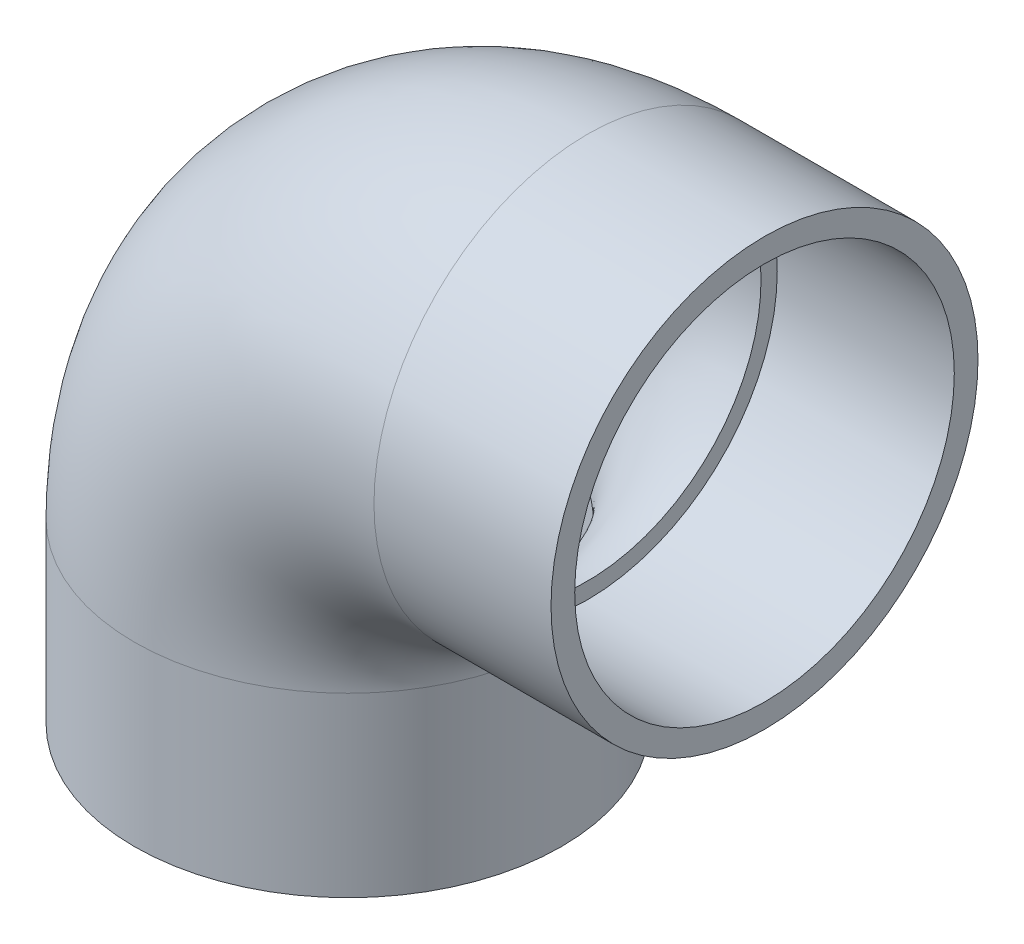
ISO-10303-21;
HEADER;
FILE_DESCRIPTION(('STEP AP214'),'2;1');
FILE_NAME('part.step','',(''),(''),'','','');
FILE_SCHEMA(('AUTOMOTIVE_DESIGN { 1 0 10303 214 1 1 1 1 }'));
ENDSEC;
DATA;
#1=APPLICATION_CONTEXT('core data for automotive mechanical design processes');
#2=APPLICATION_PROTOCOL_DEFINITION('international standard','automotive_design',2000,#1);
#3=PRODUCT_CONTEXT('',#1,'mechanical');
#4=PRODUCT('Part','Part','',(#3));
#5=PRODUCT_RELATED_PRODUCT_CATEGORY('part','',(#4));
#6=PRODUCT_DEFINITION_FORMATION('','',#4);
#7=PRODUCT_DEFINITION_CONTEXT('part definition',#1,'design');
#8=PRODUCT_DEFINITION('design','',#6,#7);
#9=PRODUCT_DEFINITION_SHAPE('','',#8);
#10=(LENGTH_UNIT() NAMED_UNIT(*) SI_UNIT(.MILLI.,.METRE.));
#11=(NAMED_UNIT(*) PLANE_ANGLE_UNIT() SI_UNIT($,.RADIAN.));
#12=(NAMED_UNIT(*) SI_UNIT($,.STERADIAN.) SOLID_ANGLE_UNIT());
#13=UNCERTAINTY_MEASURE_WITH_UNIT(LENGTH_MEASURE(1.E-05),#10,'distance_accuracy_value','');
#14=(GEOMETRIC_REPRESENTATION_CONTEXT(3) GLOBAL_UNCERTAINTY_ASSIGNED_CONTEXT((#13)) GLOBAL_UNIT_ASSIGNED_CONTEXT((#10,
#11,#12)) REPRESENTATION_CONTEXT('',''));
#15=CARTESIAN_POINT('',(0.,0.,0.));
#16=DIRECTION('',(0.,0.,1.));
#17=DIRECTION('',(1.,0.,0.));
#18=AXIS2_PLACEMENT_3D('',#15,#16,#17);
#19=CARTESIAN_POINT('',(0.,0.,0.));
#20=DIRECTION('',(0.,1.,0.));
#21=DIRECTION('',(0.,0.,1.));
#22=AXIS2_PLACEMENT_3D('',#19,#20,#21);
#23=CYLINDRICAL_SURFACE('',#22,123.);
#24=CARTESIAN_POINT('',(0.,102.,0.));
#25=DIRECTION('',(0.,1.,0.));
#26=DIRECTION('',(0.,0.,1.));
#27=AXIS2_PLACEMENT_3D('',#24,#25,#26);
#28=CIRCLE('',#27,123.);
#29=CARTESIAN_POINT('',(-123.,102.,0.));
#30=VERTEX_POINT('',#29);
#31=EDGE_CURVE('E56',#30,#30,#28,.T.);
#32=ORIENTED_EDGE('',*,*,#31,.F.);
#33=EDGE_LOOP('',(#32));
#34=FACE_BOUND('',#33,.T.);
#35=CARTESIAN_POINT('',(0.,0.,0.));
#36=DIRECTION('',(0.,1.,0.));
#37=DIRECTION('',(0.,0.,1.));
#38=AXIS2_PLACEMENT_3D('',#35,#36,#37);
#39=CIRCLE('',#38,123.);
#40=CARTESIAN_POINT('',(0.,0.,123.));
#41=VERTEX_POINT('',#40);
#42=EDGE_CURVE('E54',#41,#41,#39,.T.);
#43=ORIENTED_EDGE('',*,*,#42,.T.);
#44=EDGE_LOOP('',(#43));
#45=FACE_BOUND('',#44,.T.);
#46=ADVANCED_FACE('F35',(#34,#45),#23,.T.);
#47=CARTESIAN_POINT('',(138.,102.,0.));
#48=DIRECTION('',(0.,0.,-1.));
#49=DIRECTION('',(-1.,0.,0.));
#50=AXIS2_PLACEMENT_3D('',#47,#48,#49);
#51=TOROIDAL_SURFACE('',#50,138.,123.);
#52=CARTESIAN_POINT('',(138.,240.,0.));
#53=DIRECTION('',(1.,0.,0.));
#54=DIRECTION('',(0.,0.,1.));
#55=AXIS2_PLACEMENT_3D('',#52,#53,#54);
#56=CIRCLE('',#55,123.);
#57=CARTESIAN_POINT('',(138.,363.,0.));
#58=VERTEX_POINT('',#57);
#59=EDGE_CURVE('E39',#58,#58,#56,.T.);
#60=CARTESIAN_POINT('',(138.,102.,0.));
#61=DIRECTION('',(0.,0.,-1.));
#62=DIRECTION('',(-1.,0.,0.));
#63=AXIS2_PLACEMENT_3D('',#60,#61,#62);
#64=CIRCLE('',#63,261.);
#65=EDGE_CURVE('',#30,#58,#64,.T.);
#66=ORIENTED_EDGE('',*,*,#31,.T.);
#67=ORIENTED_EDGE('',*,*,#59,.F.);
#68=ORIENTED_EDGE('',*,*,#65,.T.);
#69=ORIENTED_EDGE('',*,*,#65,.F.);
#70=EDGE_LOOP('',(#66,#68,#67,#69));
#71=FACE_BOUND('',#70,.T.);
#72=ADVANCED_FACE('F95',(#71),#51,.T.);
#73=CARTESIAN_POINT('',(138.,240.,0.));
#74=DIRECTION('',(1.,0.,0.));
#75=DIRECTION('',(0.,1.,0.));
#76=AXIS2_PLACEMENT_3D('',#73,#74,#75);
#77=CYLINDRICAL_SURFACE('',#76,123.);
#78=CARTESIAN_POINT('',(240.,240.,0.));
#79=DIRECTION('',(1.,0.,0.));
#80=DIRECTION('',(0.,0.,1.));
#81=AXIS2_PLACEMENT_3D('',#78,#79,#80);
#82=CIRCLE('',#81,123.);
#83=CARTESIAN_POINT('',(240.,240.,123.));
#84=VERTEX_POINT('',#83);
#85=EDGE_CURVE('E48',#84,#84,#82,.T.);
#86=ORIENTED_EDGE('',*,*,#85,.F.);
#87=EDGE_LOOP('',(#86));
#88=FACE_BOUND('',#87,.T.);
#89=ORIENTED_EDGE('',*,*,#59,.T.);
#90=EDGE_LOOP('',(#89));
#91=FACE_BOUND('',#90,.T.);
#92=ADVANCED_FACE('F37',(#88,#91),#77,.T.);
#93=CARTESIAN_POINT('',(0.,0.,0.));
#94=DIRECTION('',(0.,1.,0.));
#95=DIRECTION('',(0.,0.,1.));
#96=AXIS2_PLACEMENT_3D('',#93,#94,#95);
#97=PLANE('',#96);
#98=CARTESIAN_POINT('',(0.,0.,0.));
#99=DIRECTION('',(0.,-1.,0.));
#100=DIRECTION('',(0.,0.,-1.));
#101=AXIS2_PLACEMENT_3D('',#98,#99,#100);
#102=CIRCLE('',#101,109.35);
#103=CARTESIAN_POINT('',(0.,0.,-109.35));
#104=VERTEX_POINT('',#103);
#105=EDGE_CURVE('E63',#104,#104,#102,.T.);
#106=ORIENTED_EDGE('',*,*,#105,.F.);
#107=EDGE_LOOP('',(#106));
#108=FACE_BOUND('',#107,.T.);
#109=ORIENTED_EDGE('',*,*,#42,.F.);
#110=EDGE_LOOP('',(#109));
#111=FACE_BOUND('',#110,.T.);
#112=ADVANCED_FACE('F89',(#108,#111),#97,.F.);
#113=CARTESIAN_POINT('',(240.,240.,0.));
#114=DIRECTION('',(1.,0.,0.));
#115=DIRECTION('',(0.,0.,1.));
#116=AXIS2_PLACEMENT_3D('',#113,#114,#115);
#117=PLANE('',#116);
#118=CARTESIAN_POINT('',(240.,240.,0.));
#119=DIRECTION('',(1.,0.,0.));
#120=DIRECTION('',(0.,1.,0.));
#121=AXIS2_PLACEMENT_3D('',#118,#119,#120);
#122=CIRCLE('',#121,109.35);
#123=CARTESIAN_POINT('',(240.,349.35,0.));
#124=VERTEX_POINT('',#123);
#125=EDGE_CURVE('E70',#124,#124,#122,.T.);
#126=ORIENTED_EDGE('',*,*,#125,.F.);
#127=EDGE_LOOP('',(#126));
#128=FACE_BOUND('',#127,.T.);
#129=ORIENTED_EDGE('',*,*,#85,.T.);
#130=EDGE_LOOP('',(#129));
#131=FACE_BOUND('',#130,.T.);
#132=ADVANCED_FACE('F85',(#128,#131),#117,.T.);
#133=CARTESIAN_POINT('',(138.,102.,0.));
#134=DIRECTION('',(0.,0.,-1.));
#135=DIRECTION('',(-1.,0.,0.));
#136=AXIS2_PLACEMENT_3D('',#133,#134,#135);
#137=TOROIDAL_SURFACE('',#136,138.,100.);
#138=CARTESIAN_POINT('',(0.,102.,0.));
#139=DIRECTION('',(0.,1.,0.));
#140=DIRECTION('',(0.,0.,1.));
#141=AXIS2_PLACEMENT_3D('',#138,#139,#140);
#142=CIRCLE('',#141,100.);
#143=CARTESIAN_POINT('',(-100.,102.,0.));
#144=VERTEX_POINT('',#143);
#145=EDGE_CURVE('E43',#144,#144,#142,.F.);
#146=CARTESIAN_POINT('',(138.,240.,0.));
#147=DIRECTION('',(1.,0.,0.));
#148=DIRECTION('',(0.,0.,1.));
#149=AXIS2_PLACEMENT_3D('',#146,#147,#148);
#150=CIRCLE('',#149,100.);
#151=CARTESIAN_POINT('',(138.,340.,0.));
#152=VERTEX_POINT('',#151);
#153=EDGE_CURVE('E10',#152,#152,#150,.F.);
#154=CARTESIAN_POINT('',(138.,102.,0.));
#155=DIRECTION('',(0.,0.,-1.));
#156=DIRECTION('',(-1.,0.,0.));
#157=AXIS2_PLACEMENT_3D('',#154,#155,#156);
#158=CIRCLE('',#157,238.);
#159=EDGE_CURVE('',#144,#152,#158,.T.);
#160=ORIENTED_EDGE('',*,*,#145,.T.);
#161=ORIENTED_EDGE('',*,*,#153,.F.);
#162=ORIENTED_EDGE('',*,*,#159,.T.);
#163=ORIENTED_EDGE('',*,*,#159,.F.);
#164=EDGE_LOOP('',(#160,#162,#161,#163));
#165=FACE_BOUND('',#164,.T.);
#166=ADVANCED_FACE('F88',(#165),#137,.F.);
#167=CARTESIAN_POINT('',(0.,102.,0.));
#168=DIRECTION('',(0.,-1.,0.));
#169=DIRECTION('',(0.,0.,-1.));
#170=AXIS2_PLACEMENT_3D('',#167,#168,#169);
#171=CYLINDRICAL_SURFACE('',#170,109.35);
#172=CARTESIAN_POINT('',(0.,102.,0.));
#173=DIRECTION('',(0.,-1.,0.));
#174=DIRECTION('',(0.,0.,-1.));
#175=AXIS2_PLACEMENT_3D('',#172,#173,#174);
#176=CIRCLE('',#175,109.35);
#177=CARTESIAN_POINT('',(0.,102.,-109.35));
#178=VERTEX_POINT('',#177);
#179=EDGE_CURVE('E58',#178,#178,#176,.T.);
#180=ORIENTED_EDGE('',*,*,#179,.F.);
#181=EDGE_LOOP('',(#180));
#182=FACE_BOUND('',#181,.T.);
#183=ORIENTED_EDGE('',*,*,#105,.T.);
#184=EDGE_LOOP('',(#183));
#185=FACE_BOUND('',#184,.T.);
#186=ADVANCED_FACE('F104',(#182,#185),#171,.F.);
#187=CARTESIAN_POINT('',(0.,102.,0.));
#188=DIRECTION('',(0.,-1.,0.));
#189=DIRECTION('',(0.,0.,-1.));
#190=AXIS2_PLACEMENT_3D('',#187,#188,#189);
#191=PLANE('',#190);
#192=ORIENTED_EDGE('',*,*,#145,.F.);
#193=EDGE_LOOP('',(#192));
#194=FACE_BOUND('',#193,.T.);
#195=ORIENTED_EDGE('',*,*,#179,.T.);
#196=EDGE_LOOP('',(#195));
#197=FACE_BOUND('',#196,.T.);
#198=ADVANCED_FACE('F81',(#194,#197),#191,.T.);
#199=CARTESIAN_POINT('',(138.,240.,0.));
#200=DIRECTION('',(1.,0.,0.));
#201=DIRECTION('',(0.,1.,0.));
#202=AXIS2_PLACEMENT_3D('',#199,#200,#201);
#203=CYLINDRICAL_SURFACE('',#202,109.35);
#204=CARTESIAN_POINT('',(138.,240.,0.));
#205=DIRECTION('',(1.,0.,0.));
#206=DIRECTION('',(0.,1.,0.));
#207=AXIS2_PLACEMENT_3D('',#204,#205,#206);
#208=CIRCLE('',#207,109.35);
#209=CARTESIAN_POINT('',(138.,349.35,0.));
#210=VERTEX_POINT('',#209);
#211=EDGE_CURVE('E68',#210,#210,#208,.T.);
#212=ORIENTED_EDGE('',*,*,#211,.F.);
#213=EDGE_LOOP('',(#212));
#214=FACE_BOUND('',#213,.T.);
#215=ORIENTED_EDGE('',*,*,#125,.T.);
#216=EDGE_LOOP('',(#215));
#217=FACE_BOUND('',#216,.T.);
#218=ADVANCED_FACE('F78',(#214,#217),#203,.F.);
#219=CARTESIAN_POINT('',(138.,240.,0.));
#220=DIRECTION('',(1.,0.,0.));
#221=DIRECTION('',(0.,1.,0.));
#222=AXIS2_PLACEMENT_3D('',#219,#220,#221);
#223=PLANE('',#222);
#224=ORIENTED_EDGE('',*,*,#153,.T.);
#225=EDGE_LOOP('',(#224));
#226=FACE_BOUND('',#225,.T.);
#227=ORIENTED_EDGE('',*,*,#211,.T.);
#228=EDGE_LOOP('',(#227));
#229=FACE_BOUND('',#228,.T.);
#230=ADVANCED_FACE('F76',(#226,#229),#223,.T.);
#231=CLOSED_SHELL('',(#46,#72,#92,#112,#132,#166,#186,#198,#218,#230));
#232=MANIFOLD_SOLID_BREP('B2',#231);
#233=ADVANCED_BREP_SHAPE_REPRESENTATION('',(#18,#232),#14);
#234=SHAPE_DEFINITION_REPRESENTATION(#9,#233);
ENDSEC;
END-ISO-10303-21;
